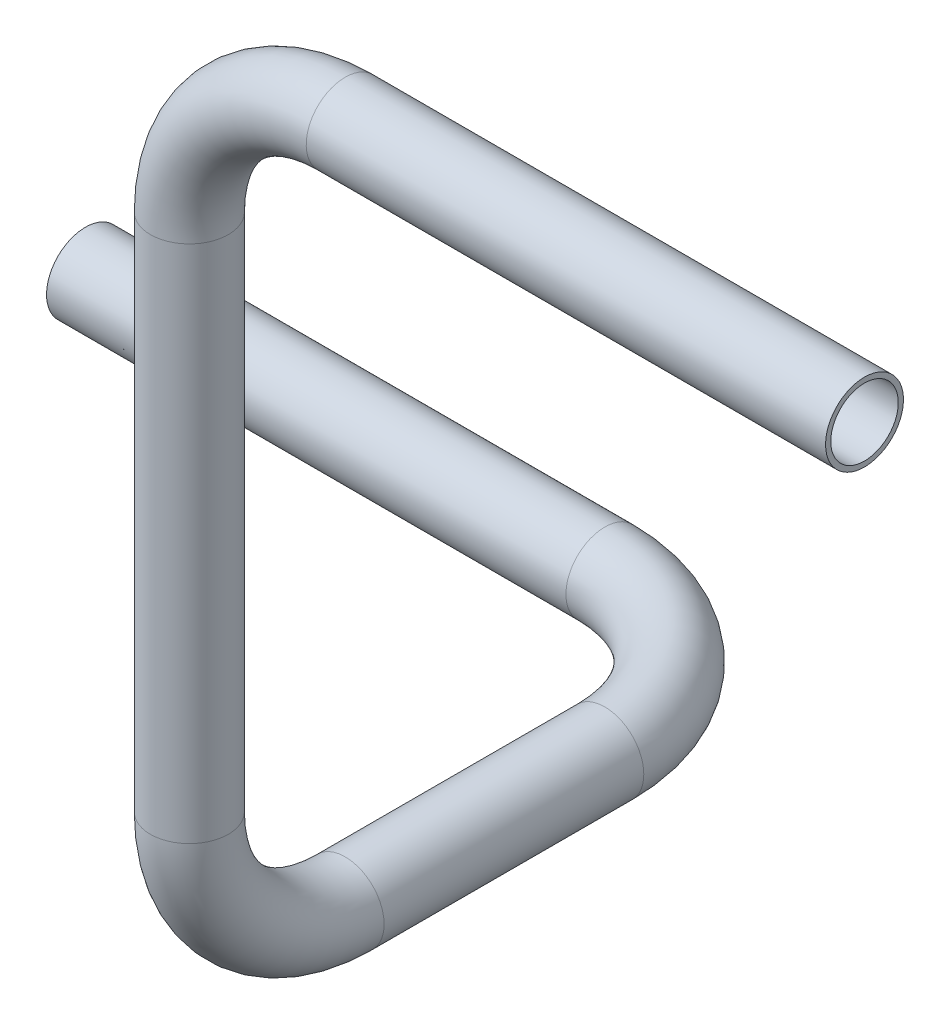
ISO-10303-21;
HEADER;
FILE_DESCRIPTION(('STEP AP214'),'2;1');
FILE_NAME('part.step','',(''),(''),'','','');
FILE_SCHEMA(('AUTOMOTIVE_DESIGN { 1 0 10303 214 1 1 1 1 }'));
ENDSEC;
DATA;
#1=APPLICATION_CONTEXT('core data for automotive mechanical design processes');
#2=APPLICATION_PROTOCOL_DEFINITION('international standard','automotive_design',2000,#1);
#3=PRODUCT_CONTEXT('',#1,'mechanical');
#4=PRODUCT('Part','Part','',(#3));
#5=PRODUCT_RELATED_PRODUCT_CATEGORY('part','',(#4));
#6=PRODUCT_DEFINITION_FORMATION('','',#4);
#7=PRODUCT_DEFINITION_CONTEXT('part definition',#1,'design');
#8=PRODUCT_DEFINITION('design','',#6,#7);
#9=PRODUCT_DEFINITION_SHAPE('','',#8);
#10=(LENGTH_UNIT() NAMED_UNIT(*) SI_UNIT(.MILLI.,.METRE.));
#11=(NAMED_UNIT(*) PLANE_ANGLE_UNIT() SI_UNIT($,.RADIAN.));
#12=(NAMED_UNIT(*) SI_UNIT($,.STERADIAN.) SOLID_ANGLE_UNIT());
#13=UNCERTAINTY_MEASURE_WITH_UNIT(LENGTH_MEASURE(1.E-05),#10,'distance_accuracy_value','');
#14=(GEOMETRIC_REPRESENTATION_CONTEXT(3) GLOBAL_UNCERTAINTY_ASSIGNED_CONTEXT((#13)) GLOBAL_UNIT_ASSIGNED_CONTEXT((#10,
#11,#12)) REPRESENTATION_CONTEXT('',''));
#15=CARTESIAN_POINT('',(0.,0.,0.));
#16=DIRECTION('',(0.,0.,1.));
#17=DIRECTION('',(1.,0.,0.));
#18=AXIS2_PLACEMENT_3D('',#15,#16,#17);
#19=CARTESIAN_POINT('',(0.,0.,0.));
#20=DIRECTION('',(-1.,0.,0.));
#21=DIRECTION('',(0.,-1.,0.));
#22=AXIS2_PLACEMENT_3D('',#19,#20,#21);
#23=PLANE('',#22);
#24=CARTESIAN_POINT('',(0.,0.,0.));
#25=DIRECTION('',(-1.,0.,0.));
#26=DIRECTION('',(0.,0.,1.));
#27=AXIS2_PLACEMENT_3D('',#24,#25,#26);
#28=CIRCLE('',#27,13.);
#29=CARTESIAN_POINT('',(0.,0.,13.));
#30=VERTEX_POINT('',#29);
#31=EDGE_CURVE('E78',#30,#30,#28,.T.);
#32=ORIENTED_EDGE('',*,*,#31,.F.);
#33=EDGE_LOOP('',(#32));
#34=FACE_BOUND('',#33,.T.);
#35=CARTESIAN_POINT('',(0.,0.,0.));
#36=DIRECTION('',(-1.,0.,0.));
#37=DIRECTION('',(0.,-1.,0.));
#38=AXIS2_PLACEMENT_3D('',#35,#36,#37);
#39=CIRCLE('',#38,15.);
#40=CARTESIAN_POINT('',(0.,-15.,0.));
#41=VERTEX_POINT('',#40);
#42=EDGE_CURVE('E71',#41,#41,#39,.T.);
#43=ORIENTED_EDGE('',*,*,#42,.T.);
#44=EDGE_LOOP('',(#43));
#45=FACE_BOUND('',#44,.T.);
#46=ADVANCED_FACE('F43',(#34,#45),#23,.T.);
#47=CARTESIAN_POINT('',(520.,320.,220.));
#48=DIRECTION('',(-1.,0.,0.));
#49=DIRECTION('',(0.,0.,1.));
#50=AXIS2_PLACEMENT_3D('',#47,#48,#49);
#51=PLANE('',#50);
#52=CARTESIAN_POINT('',(520.,320.,220.));
#53=DIRECTION('',(-1.,0.,0.));
#54=DIRECTION('',(0.,0.,1.));
#55=AXIS2_PLACEMENT_3D('',#52,#53,#54);
#56=CIRCLE('',#55,13.);
#57=CARTESIAN_POINT('',(520.,320.,233.));
#58=VERTEX_POINT('',#57);
#59=EDGE_CURVE('E74',#58,#58,#56,.T.);
#60=ORIENTED_EDGE('',*,*,#59,.T.);
#61=EDGE_LOOP('',(#60));
#62=FACE_BOUND('',#61,.T.);
#63=CARTESIAN_POINT('',(520.,320.,220.));
#64=DIRECTION('',(-1.,0.,0.));
#65=DIRECTION('',(0.,0.,1.));
#66=AXIS2_PLACEMENT_3D('',#63,#64,#65);
#67=CIRCLE('',#66,15.);
#68=CARTESIAN_POINT('',(520.,320.,235.));
#69=VERTEX_POINT('',#68);
#70=EDGE_CURVE('E11',#69,#69,#67,.T.);
#71=ORIENTED_EDGE('',*,*,#70,.F.);
#72=EDGE_LOOP('',(#71));
#73=FACE_BOUND('',#72,.T.);
#74=ADVANCED_FACE('F110',(#62,#73),#51,.F.);
#75=CARTESIAN_POINT('',(0.,0.,0.));
#76=DIRECTION('',(1.,0.,0.));
#77=DIRECTION('',(0.,0.,-1.));
#78=AXIS2_PLACEMENT_3D('',#75,#76,#77);
#79=CYLINDRICAL_SURFACE('',#78,15.);
#80=CARTESIAN_POINT('',(200.,0.,0.));
#81=DIRECTION('',(-1.,0.,0.));
#82=DIRECTION('',(0.,-1.,0.));
#83=AXIS2_PLACEMENT_3D('',#80,#81,#82);
#84=CIRCLE('',#83,15.);
#85=CARTESIAN_POINT('',(200.,0.,-15.));
#86=VERTEX_POINT('',#85);
#87=EDGE_CURVE('E68',#86,#86,#84,.T.);
#88=ORIENTED_EDGE('',*,*,#87,.T.);
#89=EDGE_LOOP('',(#88));
#90=FACE_BOUND('',#89,.T.);
#91=ORIENTED_EDGE('',*,*,#42,.F.);
#92=EDGE_LOOP('',(#91));
#93=FACE_BOUND('',#92,.T.);
#94=ADVANCED_FACE('F114',(#90,#93),#79,.T.);
#95=CARTESIAN_POINT('',(200.,0.,60.));
#96=DIRECTION('',(0.,-1.,0.));
#97=DIRECTION('',(0.,0.,-1.));
#98=AXIS2_PLACEMENT_3D('',#95,#96,#97);
#99=TOROIDAL_SURFACE('',#98,60.,15.);
#100=CARTESIAN_POINT('',(260.,0.,60.));
#101=DIRECTION('',(0.,0.,-1.));
#102=DIRECTION('',(0.,-1.,0.));
#103=AXIS2_PLACEMENT_3D('',#100,#101,#102);
#104=CIRCLE('',#103,15.);
#105=CARTESIAN_POINT('',(275.,0.,60.));
#106=VERTEX_POINT('',#105);
#107=EDGE_CURVE('E65',#106,#106,#104,.T.);
#108=CARTESIAN_POINT('',(200.,0.,60.));
#109=DIRECTION('',(0.,-1.,0.));
#110=DIRECTION('',(0.,0.,-1.));
#111=AXIS2_PLACEMENT_3D('',#108,#109,#110);
#112=CIRCLE('',#111,75.);
#113=EDGE_CURVE('',#86,#106,#112,.T.);
#114=ORIENTED_EDGE('',*,*,#87,.F.);
#115=ORIENTED_EDGE('',*,*,#107,.T.);
#116=ORIENTED_EDGE('',*,*,#113,.T.);
#117=ORIENTED_EDGE('',*,*,#113,.F.);
#118=EDGE_LOOP('',(#114,#116,#115,#117));
#119=FACE_BOUND('',#118,.T.);
#120=ADVANCED_FACE('F116',(#119),#99,.T.);
#121=CARTESIAN_POINT('',(260.,0.,60.));
#122=DIRECTION('',(0.,0.,1.));
#123=DIRECTION('',(1.,0.,0.));
#124=AXIS2_PLACEMENT_3D('',#121,#122,#123);
#125=CYLINDRICAL_SURFACE('',#124,15.);
#126=CARTESIAN_POINT('',(260.,0.,160.));
#127=DIRECTION('',(0.,0.,-1.));
#128=DIRECTION('',(0.,-1.,0.));
#129=AXIS2_PLACEMENT_3D('',#126,#127,#128);
#130=CIRCLE('',#129,15.);
#131=CARTESIAN_POINT('',(260.,-15.,160.));
#132=VERTEX_POINT('',#131);
#133=EDGE_CURVE('E62',#132,#132,#130,.T.);
#134=ORIENTED_EDGE('',*,*,#133,.T.);
#135=EDGE_LOOP('',(#134));
#136=FACE_BOUND('',#135,.T.);
#137=ORIENTED_EDGE('',*,*,#107,.F.);
#138=EDGE_LOOP('',(#137));
#139=FACE_BOUND('',#138,.T.);
#140=ADVANCED_FACE('F123',(#136,#139),#125,.T.);
#141=CARTESIAN_POINT('',(260.,60.,160.));
#142=DIRECTION('',(-1.,0.,0.));
#143=DIRECTION('',(0.,0.,1.));
#144=AXIS2_PLACEMENT_3D('',#141,#142,#143);
#145=TOROIDAL_SURFACE('',#144,60.,15.);
#146=CARTESIAN_POINT('',(260.,60.,220.));
#147=DIRECTION('',(0.,-1.,0.));
#148=DIRECTION('',(0.,0.,1.));
#149=AXIS2_PLACEMENT_3D('',#146,#147,#148);
#150=CIRCLE('',#149,15.);
#151=CARTESIAN_POINT('',(260.,60.,235.));
#152=VERTEX_POINT('',#151);
#153=EDGE_CURVE('E57',#152,#152,#150,.T.);
#154=CARTESIAN_POINT('',(260.,60.,160.));
#155=DIRECTION('',(-1.,0.,0.));
#156=DIRECTION('',(0.,0.,1.));
#157=AXIS2_PLACEMENT_3D('',#154,#155,#156);
#158=CIRCLE('',#157,75.);
#159=EDGE_CURVE('',#132,#152,#158,.T.);
#160=ORIENTED_EDGE('',*,*,#133,.F.);
#161=ORIENTED_EDGE('',*,*,#153,.T.);
#162=ORIENTED_EDGE('',*,*,#159,.T.);
#163=ORIENTED_EDGE('',*,*,#159,.F.);
#164=EDGE_LOOP('',(#160,#162,#161,#163));
#165=FACE_BOUND('',#164,.T.);
#166=ADVANCED_FACE('F140',(#165),#145,.T.);
#167=CARTESIAN_POINT('',(260.,60.,220.));
#168=DIRECTION('',(0.,1.,0.));
#169=DIRECTION('',(0.,0.,1.));
#170=AXIS2_PLACEMENT_3D('',#167,#168,#169);
#171=CYLINDRICAL_SURFACE('',#170,15.);
#172=CARTESIAN_POINT('',(260.,260.,220.));
#173=DIRECTION('',(0.,-1.,0.));
#174=DIRECTION('',(0.,0.,1.));
#175=AXIS2_PLACEMENT_3D('',#172,#173,#174);
#176=CIRCLE('',#175,15.);
#177=CARTESIAN_POINT('',(245.,260.,220.));
#178=VERTEX_POINT('',#177);
#179=EDGE_CURVE('E53',#178,#178,#176,.T.);
#180=ORIENTED_EDGE('',*,*,#179,.T.);
#181=EDGE_LOOP('',(#180));
#182=FACE_BOUND('',#181,.T.);
#183=ORIENTED_EDGE('',*,*,#153,.F.);
#184=EDGE_LOOP('',(#183));
#185=FACE_BOUND('',#184,.T.);
#186=ADVANCED_FACE('F134',(#182,#185),#171,.T.);
#187=CARTESIAN_POINT('',(320.,260.,220.));
#188=DIRECTION('',(0.,0.,-1.));
#189=DIRECTION('',(-1.,0.,0.));
#190=AXIS2_PLACEMENT_3D('',#187,#188,#189);
#191=TOROIDAL_SURFACE('',#190,60.,15.);
#192=CARTESIAN_POINT('',(320.,320.,220.));
#193=DIRECTION('',(-1.,0.,0.));
#194=DIRECTION('',(0.,0.,1.));
#195=AXIS2_PLACEMENT_3D('',#192,#193,#194);
#196=CIRCLE('',#195,15.);
#197=CARTESIAN_POINT('',(320.,335.,220.));
#198=VERTEX_POINT('',#197);
#199=EDGE_CURVE('E49',#198,#198,#196,.T.);
#200=CARTESIAN_POINT('',(320.,260.,220.));
#201=DIRECTION('',(0.,0.,-1.));
#202=DIRECTION('',(-1.,0.,0.));
#203=AXIS2_PLACEMENT_3D('',#200,#201,#202);
#204=CIRCLE('',#203,75.);
#205=EDGE_CURVE('',#178,#198,#204,.T.);
#206=ORIENTED_EDGE('',*,*,#179,.F.);
#207=ORIENTED_EDGE('',*,*,#199,.T.);
#208=ORIENTED_EDGE('',*,*,#205,.T.);
#209=ORIENTED_EDGE('',*,*,#205,.F.);
#210=EDGE_LOOP('',(#206,#208,#207,#209));
#211=FACE_BOUND('',#210,.T.);
#212=ADVANCED_FACE('F129',(#211),#191,.T.);
#213=CARTESIAN_POINT('',(320.,320.,220.));
#214=DIRECTION('',(1.,0.,0.));
#215=DIRECTION('',(0.,0.,-1.));
#216=AXIS2_PLACEMENT_3D('',#213,#214,#215);
#217=CYLINDRICAL_SURFACE('',#216,15.);
#218=ORIENTED_EDGE('',*,*,#70,.T.);
#219=EDGE_LOOP('',(#218));
#220=FACE_BOUND('',#219,.T.);
#221=ORIENTED_EDGE('',*,*,#199,.F.);
#222=EDGE_LOOP('',(#221));
#223=FACE_BOUND('',#222,.T.);
#224=ADVANCED_FACE('F104',(#220,#223),#217,.T.);
#225=CARTESIAN_POINT('',(0.,0.,0.));
#226=DIRECTION('',(1.,0.,0.));
#227=DIRECTION('',(0.,0.,-1.));
#228=AXIS2_PLACEMENT_3D('',#225,#226,#227);
#229=CYLINDRICAL_SURFACE('',#228,13.);
#230=CARTESIAN_POINT('',(200.,0.,0.));
#231=DIRECTION('',(1.,0.,0.));
#232=DIRECTION('',(0.,0.,-1.));
#233=AXIS2_PLACEMENT_3D('',#230,#231,#232);
#234=CIRCLE('',#233,13.);
#235=CARTESIAN_POINT('',(200.,0.,-13.));
#236=VERTEX_POINT('',#235);
#237=EDGE_CURVE('E81',#236,#236,#234,.F.);
#238=ORIENTED_EDGE('',*,*,#237,.F.);
#239=EDGE_LOOP('',(#238));
#240=FACE_BOUND('',#239,.T.);
#241=ORIENTED_EDGE('',*,*,#31,.T.);
#242=EDGE_LOOP('',(#241));
#243=FACE_BOUND('',#242,.T.);
#244=ADVANCED_FACE('F101',(#240,#243),#229,.F.);
#245=CARTESIAN_POINT('',(200.,0.,60.));
#246=DIRECTION('',(0.,-1.,0.));
#247=DIRECTION('',(0.,0.,-1.));
#248=AXIS2_PLACEMENT_3D('',#245,#246,#247);
#249=TOROIDAL_SURFACE('',#248,60.,13.);
#250=CARTESIAN_POINT('',(260.,0.,60.));
#251=DIRECTION('',(0.,0.,-1.));
#252=DIRECTION('',(-1.,0.,0.));
#253=AXIS2_PLACEMENT_3D('',#250,#251,#252);
#254=CIRCLE('',#253,13.);
#255=CARTESIAN_POINT('',(273.,0.,60.));
#256=VERTEX_POINT('',#255);
#257=EDGE_CURVE('E93',#256,#256,#254,.T.);
#258=CARTESIAN_POINT('',(200.,0.,60.));
#259=DIRECTION('',(0.,-1.,0.));
#260=DIRECTION('',(0.,0.,-1.));
#261=AXIS2_PLACEMENT_3D('',#258,#259,#260);
#262=CIRCLE('',#261,73.);
#263=EDGE_CURVE('',#236,#256,#262,.T.);
#264=ORIENTED_EDGE('',*,*,#237,.T.);
#265=ORIENTED_EDGE('',*,*,#257,.F.);
#266=ORIENTED_EDGE('',*,*,#263,.T.);
#267=ORIENTED_EDGE('',*,*,#263,.F.);
#268=EDGE_LOOP('',(#264,#266,#265,#267));
#269=FACE_BOUND('',#268,.T.);
#270=ADVANCED_FACE('F99',(#269),#249,.F.);
#271=CARTESIAN_POINT('',(260.,0.,60.));
#272=DIRECTION('',(0.,0.,1.));
#273=DIRECTION('',(1.,0.,0.));
#274=AXIS2_PLACEMENT_3D('',#271,#272,#273);
#275=CYLINDRICAL_SURFACE('',#274,13.);
#276=CARTESIAN_POINT('',(260.,0.,160.));
#277=DIRECTION('',(0.,0.,1.));
#278=DIRECTION('',(1.,0.,0.));
#279=AXIS2_PLACEMENT_3D('',#276,#277,#278);
#280=CIRCLE('',#279,13.);
#281=CARTESIAN_POINT('',(260.,-13.,160.));
#282=VERTEX_POINT('',#281);
#283=EDGE_CURVE('E90',#282,#282,#280,.F.);
#284=ORIENTED_EDGE('',*,*,#283,.F.);
#285=EDGE_LOOP('',(#284));
#286=FACE_BOUND('',#285,.T.);
#287=ORIENTED_EDGE('',*,*,#257,.T.);
#288=EDGE_LOOP('',(#287));
#289=FACE_BOUND('',#288,.T.);
#290=ADVANCED_FACE('F188',(#286,#289),#275,.F.);
#291=CARTESIAN_POINT('',(260.,60.,160.));
#292=DIRECTION('',(-1.,0.,0.));
#293=DIRECTION('',(0.,0.,1.));
#294=AXIS2_PLACEMENT_3D('',#291,#292,#293);
#295=TOROIDAL_SURFACE('',#294,60.,13.);
#296=CARTESIAN_POINT('',(260.,60.,220.));
#297=DIRECTION('',(0.,-1.,0.));
#298=DIRECTION('',(0.,0.,-1.));
#299=AXIS2_PLACEMENT_3D('',#296,#297,#298);
#300=CIRCLE('',#299,13.);
#301=CARTESIAN_POINT('',(260.,60.,233.));
#302=VERTEX_POINT('',#301);
#303=EDGE_CURVE('E87',#302,#302,#300,.T.);
#304=CARTESIAN_POINT('',(260.,60.,160.));
#305=DIRECTION('',(-1.,0.,0.));
#306=DIRECTION('',(0.,0.,1.));
#307=AXIS2_PLACEMENT_3D('',#304,#305,#306);
#308=CIRCLE('',#307,73.);
#309=EDGE_CURVE('',#282,#302,#308,.T.);
#310=ORIENTED_EDGE('',*,*,#283,.T.);
#311=ORIENTED_EDGE('',*,*,#303,.F.);
#312=ORIENTED_EDGE('',*,*,#309,.T.);
#313=ORIENTED_EDGE('',*,*,#309,.F.);
#314=EDGE_LOOP('',(#310,#312,#311,#313));
#315=FACE_BOUND('',#314,.T.);
#316=ADVANCED_FACE('F198',(#315),#295,.F.);
#317=CARTESIAN_POINT('',(260.,60.,220.));
#318=DIRECTION('',(0.,1.,0.));
#319=DIRECTION('',(0.,0.,1.));
#320=AXIS2_PLACEMENT_3D('',#317,#318,#319);
#321=CYLINDRICAL_SURFACE('',#320,13.);
#322=CARTESIAN_POINT('',(260.,260.,220.));
#323=DIRECTION('',(0.,1.,0.));
#324=DIRECTION('',(0.,0.,1.));
#325=AXIS2_PLACEMENT_3D('',#322,#323,#324);
#326=CIRCLE('',#325,13.);
#327=CARTESIAN_POINT('',(247.,260.,220.));
#328=VERTEX_POINT('',#327);
#329=EDGE_CURVE('E84',#328,#328,#326,.F.);
#330=ORIENTED_EDGE('',*,*,#329,.F.);
#331=EDGE_LOOP('',(#330));
#332=FACE_BOUND('',#331,.T.);
#333=ORIENTED_EDGE('',*,*,#303,.T.);
#334=EDGE_LOOP('',(#333));
#335=FACE_BOUND('',#334,.T.);
#336=ADVANCED_FACE('F208',(#332,#335),#321,.F.);
#337=CARTESIAN_POINT('',(320.,260.,220.));
#338=DIRECTION('',(0.,0.,-1.));
#339=DIRECTION('',(-1.,0.,0.));
#340=AXIS2_PLACEMENT_3D('',#337,#338,#339);
#341=TOROIDAL_SURFACE('',#340,60.,13.);
#342=CARTESIAN_POINT('',(320.,320.,220.));
#343=DIRECTION('',(-1.,0.,0.));
#344=DIRECTION('',(0.,-1.,0.));
#345=AXIS2_PLACEMENT_3D('',#342,#343,#344);
#346=CIRCLE('',#345,13.);
#347=CARTESIAN_POINT('',(320.,333.,220.));
#348=VERTEX_POINT('',#347);
#349=EDGE_CURVE('E77',#348,#348,#346,.T.);
#350=CARTESIAN_POINT('',(320.,260.,220.));
#351=DIRECTION('',(0.,0.,-1.));
#352=DIRECTION('',(-1.,0.,0.));
#353=AXIS2_PLACEMENT_3D('',#350,#351,#352);
#354=CIRCLE('',#353,73.);
#355=EDGE_CURVE('',#328,#348,#354,.T.);
#356=ORIENTED_EDGE('',*,*,#329,.T.);
#357=ORIENTED_EDGE('',*,*,#349,.F.);
#358=ORIENTED_EDGE('',*,*,#355,.T.);
#359=ORIENTED_EDGE('',*,*,#355,.F.);
#360=EDGE_LOOP('',(#356,#358,#357,#359));
#361=FACE_BOUND('',#360,.T.);
#362=ADVANCED_FACE('F218',(#361),#341,.F.);
#363=CARTESIAN_POINT('',(320.,320.,220.));
#364=DIRECTION('',(1.,0.,0.));
#365=DIRECTION('',(0.,0.,-1.));
#366=AXIS2_PLACEMENT_3D('',#363,#364,#365);
#367=CYLINDRICAL_SURFACE('',#366,13.);
#368=ORIENTED_EDGE('',*,*,#59,.F.);
#369=EDGE_LOOP('',(#368));
#370=FACE_BOUND('',#369,.T.);
#371=ORIENTED_EDGE('',*,*,#349,.T.);
#372=EDGE_LOOP('',(#371));
#373=FACE_BOUND('',#372,.T.);
#374=ADVANCED_FACE('F111',(#370,#373),#367,.F.);
#375=CLOSED_SHELL('',(#46,#74,#94,#120,#140,#166,#186,#212,#224,#244,#270,#290,#316,#336,#362,#374));
#376=MANIFOLD_SOLID_BREP('B2',#375);
#377=ADVANCED_BREP_SHAPE_REPRESENTATION('',(#18,#376),#14);
#378=SHAPE_DEFINITION_REPRESENTATION(#9,#377);
ENDSEC;
END-ISO-10303-21;
